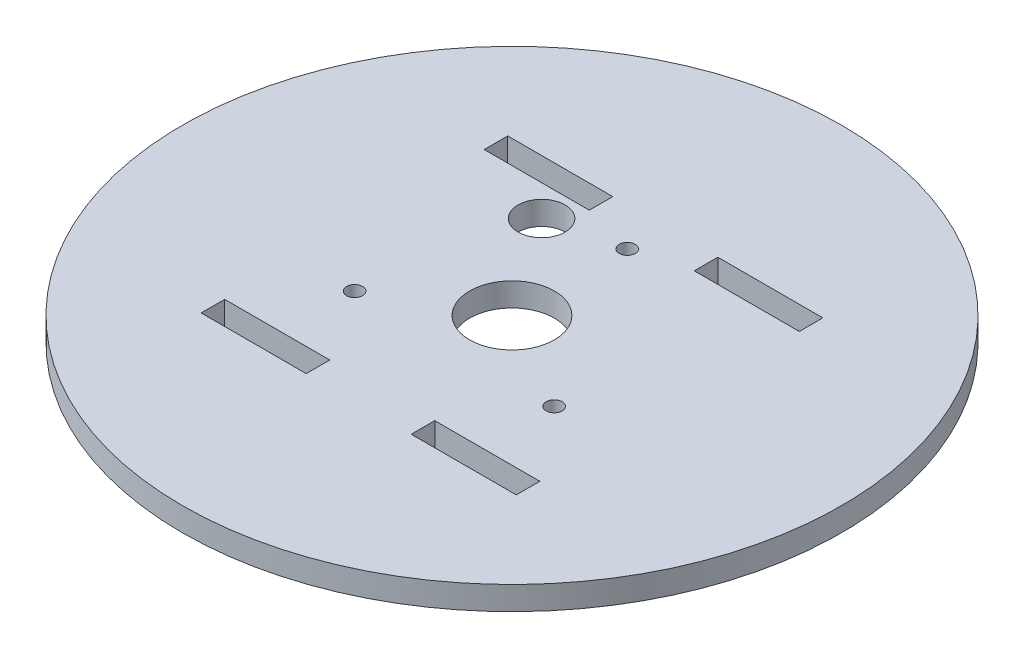
ISO-10303-21;
HEADER;
FILE_DESCRIPTION(('STEP AP214'),'2;1');
FILE_NAME('part.step','',(''),(''),'','','');
FILE_SCHEMA(('AUTOMOTIVE_DESIGN { 1 0 10303 214 1 1 1 1 }'));
ENDSEC;
DATA;
#1=APPLICATION_CONTEXT('core data for automotive mechanical design processes');
#2=APPLICATION_PROTOCOL_DEFINITION('international standard','automotive_design',2000,#1);
#3=PRODUCT_CONTEXT('',#1,'mechanical');
#4=PRODUCT('Part','Part','',(#3));
#5=PRODUCT_RELATED_PRODUCT_CATEGORY('part','',(#4));
#6=PRODUCT_DEFINITION_FORMATION('','',#4);
#7=PRODUCT_DEFINITION_CONTEXT('part definition',#1,'design');
#8=PRODUCT_DEFINITION('design','',#6,#7);
#9=PRODUCT_DEFINITION_SHAPE('','',#8);
#10=(LENGTH_UNIT() NAMED_UNIT(*) SI_UNIT(.MILLI.,.METRE.));
#11=(NAMED_UNIT(*) PLANE_ANGLE_UNIT() SI_UNIT($,.RADIAN.));
#12=(NAMED_UNIT(*) SI_UNIT($,.STERADIAN.) SOLID_ANGLE_UNIT());
#13=UNCERTAINTY_MEASURE_WITH_UNIT(LENGTH_MEASURE(1.E-05),#10,'distance_accuracy_value','');
#14=(GEOMETRIC_REPRESENTATION_CONTEXT(3) GLOBAL_UNCERTAINTY_ASSIGNED_CONTEXT((#13)) GLOBAL_UNIT_ASSIGNED_CONTEXT((#10,
#11,#12)) REPRESENTATION_CONTEXT('',''));
#15=CARTESIAN_POINT('',(0.,0.,0.));
#16=DIRECTION('',(0.,0.,1.));
#17=DIRECTION('',(1.,0.,0.));
#18=AXIS2_PLACEMENT_3D('',#15,#16,#17);
#19=CARTESIAN_POINT('',(0.,6.35,0.));
#20=DIRECTION('',(0.,1.,0.));
#21=DIRECTION('',(0.,0.,1.));
#22=AXIS2_PLACEMENT_3D('',#19,#20,#21);
#23=PLANE('',#22);
#24=DIRECTION('',(0.,0.,-1.));
#25=VECTOR('',#24,1.);
#26=CARTESIAN_POINT('',(-14.1666666666667,6.35,41.35));
#27=LINE('',#26,#25);
#28=CARTESIAN_POINT('',(-14.1666666666667,6.35,41.35));
#29=VERTEX_POINT('',#28);
#30=CARTESIAN_POINT('',(-14.1666666666667,6.35,35.));
#31=VERTEX_POINT('',#30);
#32=EDGE_CURVE('E46',#29,#31,#27,.T.);
#33=ORIENTED_EDGE('',*,*,#32,.F.);
#34=DIRECTION('',(1.,0.,0.));
#35=VECTOR('',#34,1.);
#36=CARTESIAN_POINT('',(-42.5,6.35,41.35));
#37=LINE('',#36,#35);
#38=CARTESIAN_POINT('',(-42.5,6.35,41.35));
#39=VERTEX_POINT('',#38);
#40=EDGE_CURVE('E152',#39,#29,#37,.T.);
#41=ORIENTED_EDGE('',*,*,#40,.F.);
#42=DIRECTION('',(0.,0.,1.));
#43=VECTOR('',#42,1.);
#44=CARTESIAN_POINT('',(-42.5,6.35,35.));
#45=LINE('',#44,#43);
#46=CARTESIAN_POINT('',(-42.5,6.35,35.));
#47=VERTEX_POINT('',#46);
#48=EDGE_CURVE('E172',#47,#39,#45,.T.);
#49=ORIENTED_EDGE('',*,*,#48,.F.);
#50=DIRECTION('',(-1.,0.,0.));
#51=VECTOR('',#50,1.);
#52=CARTESIAN_POINT('',(-14.1666666666667,6.35,35.));
#53=LINE('',#52,#51);
#54=EDGE_CURVE('E166',#31,#47,#53,.T.);
#55=ORIENTED_EDGE('',*,*,#54,.F.);
#56=EDGE_LOOP('',(#33,#41,#49,#55));
#57=FACE_BOUND('',#56,.T.);
#58=DIRECTION('',(0.,0.,-1.));
#59=VECTOR('',#58,1.);
#60=CARTESIAN_POINT('',(42.5,6.35,41.35));
#61=LINE('',#60,#59);
#62=CARTESIAN_POINT('',(42.5,6.35,41.35));
#63=VERTEX_POINT('',#62);
#64=CARTESIAN_POINT('',(42.5,6.35,35.));
#65=VERTEX_POINT('',#64);
#66=EDGE_CURVE('E188',#63,#65,#61,.T.);
#67=ORIENTED_EDGE('',*,*,#66,.F.);
#68=DIRECTION('',(1.,0.,0.));
#69=VECTOR('',#68,1.);
#70=CARTESIAN_POINT('',(14.1666666666667,6.35,41.35));
#71=LINE('',#70,#69);
#72=CARTESIAN_POINT('',(14.1666666666667,6.35,41.35));
#73=VERTEX_POINT('',#72);
#74=EDGE_CURVE('E196',#73,#63,#71,.T.);
#75=ORIENTED_EDGE('',*,*,#74,.F.);
#76=DIRECTION('',(0.,0.,1.));
#77=VECTOR('',#76,1.);
#78=CARTESIAN_POINT('',(14.1666666666667,6.35,35.));
#79=LINE('',#78,#77);
#80=CARTESIAN_POINT('',(14.1666666666667,6.35,35.));
#81=VERTEX_POINT('',#80);
#82=EDGE_CURVE('E193',#81,#73,#79,.T.);
#83=ORIENTED_EDGE('',*,*,#82,.F.);
#84=DIRECTION('',(-1.,0.,0.));
#85=VECTOR('',#84,1.);
#86=CARTESIAN_POINT('',(42.5,6.35,35.));
#87=LINE('',#86,#85);
#88=EDGE_CURVE('E190',#65,#81,#87,.T.);
#89=ORIENTED_EDGE('',*,*,#88,.F.);
#90=EDGE_LOOP('',(#67,#75,#83,#89));
#91=FACE_BOUND('',#90,.T.);
#92=DIRECTION('',(1.,0.,0.));
#93=VECTOR('',#92,1.);
#94=CARTESIAN_POINT('',(42.5,6.35,-35.));
#95=LINE('',#94,#93);
#96=CARTESIAN_POINT('',(14.1666666666667,6.35,-35.));
#97=VERTEX_POINT('',#96);
#98=CARTESIAN_POINT('',(42.5,6.35,-35.));
#99=VERTEX_POINT('',#98);
#100=EDGE_CURVE('E219',#97,#99,#95,.T.);
#101=ORIENTED_EDGE('',*,*,#100,.F.);
#102=DIRECTION('',(0.,0.,1.));
#103=VECTOR('',#102,1.);
#104=CARTESIAN_POINT('',(14.1666666666667,6.35,-35.));
#105=LINE('',#104,#103);
#106=CARTESIAN_POINT('',(14.1666666666667,6.35,-41.35));
#107=VERTEX_POINT('',#106);
#108=EDGE_CURVE('E227',#107,#97,#105,.T.);
#109=ORIENTED_EDGE('',*,*,#108,.F.);
#110=DIRECTION('',(-1.,0.,0.));
#111=VECTOR('',#110,1.);
#112=CARTESIAN_POINT('',(14.1666666666667,6.35,-41.35));
#113=LINE('',#112,#111);
#114=CARTESIAN_POINT('',(42.5,6.35,-41.35));
#115=VERTEX_POINT('',#114);
#116=EDGE_CURVE('E224',#115,#107,#113,.T.);
#117=ORIENTED_EDGE('',*,*,#116,.F.);
#118=DIRECTION('',(0.,0.,-1.));
#119=VECTOR('',#118,1.);
#120=CARTESIAN_POINT('',(42.5,6.35,-41.35));
#121=LINE('',#120,#119);
#122=EDGE_CURVE('E221',#99,#115,#121,.T.);
#123=ORIENTED_EDGE('',*,*,#122,.F.);
#124=EDGE_LOOP('',(#101,#109,#117,#123));
#125=FACE_BOUND('',#124,.T.);
#126=DIRECTION('',(1.,0.,0.));
#127=VECTOR('',#126,1.);
#128=CARTESIAN_POINT('',(-14.1666666666667,6.35,-35.));
#129=LINE('',#128,#127);
#130=CARTESIAN_POINT('',(-42.5,6.35,-35.));
#131=VERTEX_POINT('',#130);
#132=CARTESIAN_POINT('',(-14.1666666666667,6.35,-35.));
#133=VERTEX_POINT('',#132);
#134=EDGE_CURVE('E250',#131,#133,#129,.T.);
#135=ORIENTED_EDGE('',*,*,#134,.F.);
#136=DIRECTION('',(0.,0.,1.));
#137=VECTOR('',#136,1.);
#138=CARTESIAN_POINT('',(-42.5,6.35,-35.));
#139=LINE('',#138,#137);
#140=CARTESIAN_POINT('',(-42.5,6.35,-41.35));
#141=VERTEX_POINT('',#140);
#142=EDGE_CURVE('E258',#141,#131,#139,.T.);
#143=ORIENTED_EDGE('',*,*,#142,.F.);
#144=DIRECTION('',(-1.,0.,0.));
#145=VECTOR('',#144,1.);
#146=CARTESIAN_POINT('',(-42.5,6.35,-41.35));
#147=LINE('',#146,#145);
#148=CARTESIAN_POINT('',(-14.1666666666667,6.35,-41.35));
#149=VERTEX_POINT('',#148);
#150=EDGE_CURVE('E255',#149,#141,#147,.T.);
#151=ORIENTED_EDGE('',*,*,#150,.F.);
#152=DIRECTION('',(0.,0.,-1.));
#153=VECTOR('',#152,1.);
#154=CARTESIAN_POINT('',(-14.1666666666667,6.35,-41.35));
#155=LINE('',#154,#153);
#156=EDGE_CURVE('E252',#133,#149,#155,.T.);
#157=ORIENTED_EDGE('',*,*,#156,.F.);
#158=EDGE_LOOP('',(#135,#143,#151,#157));
#159=FACE_BOUND('',#158,.T.);
#160=CARTESIAN_POINT('',(26.9238637782543,6.35,15.5444999999999));
#161=DIRECTION('',(0.,1.,0.));
#162=DIRECTION('',(0.,0.,1.));
#163=AXIS2_PLACEMENT_3D('',#160,#161,#162);
#164=CIRCLE('',#163,2.159);
#165=CARTESIAN_POINT('',(26.9238637782543,6.35,17.7034999999999));
#166=VERTEX_POINT('',#165);
#167=EDGE_CURVE('E280',#166,#166,#164,.T.);
#168=ORIENTED_EDGE('',*,*,#167,.F.);
#169=EDGE_LOOP('',(#168));
#170=FACE_BOUND('',#169,.T.);
#171=CARTESIAN_POINT('',(0.,6.35,-31.089));
#172=DIRECTION('',(0.,1.,0.));
#173=DIRECTION('',(0.,0.,1.));
#174=AXIS2_PLACEMENT_3D('',#171,#172,#173);
#175=CIRCLE('',#174,2.159);
#176=CARTESIAN_POINT('',(0.,6.35,-28.93));
#177=VERTEX_POINT('',#176);
#178=EDGE_CURVE('E292',#177,#177,#175,.T.);
#179=ORIENTED_EDGE('',*,*,#178,.F.);
#180=EDGE_LOOP('',(#179));
#181=FACE_BOUND('',#180,.T.);
#182=CARTESIAN_POINT('',(0.,6.35,0.));
#183=DIRECTION('',(0.,1.,0.));
#184=DIRECTION('',(0.,0.,1.));
#185=AXIS2_PLACEMENT_3D('',#182,#183,#184);
#186=CIRCLE('',#185,88.9);
#187=CARTESIAN_POINT('',(0.,6.35,88.9));
#188=VERTEX_POINT('',#187);
#189=EDGE_CURVE('E11',#188,#188,#186,.T.);
#190=ORIENTED_EDGE('',*,*,#189,.T.);
#191=EDGE_LOOP('',(#190));
#192=FACE_BOUND('',#191,.T.);
#193=CARTESIAN_POINT('',(0.,6.35,0.));
#194=DIRECTION('',(0.,1.,0.));
#195=DIRECTION('',(0.,0.,1.));
#196=AXIS2_PLACEMENT_3D('',#193,#194,#195);
#197=CIRCLE('',#196,11.43);
#198=CARTESIAN_POINT('',(0.,6.35,11.43));
#199=VERTEX_POINT('',#198);
#200=EDGE_CURVE('E298',#199,#199,#197,.T.);
#201=ORIENTED_EDGE('',*,*,#200,.F.);
#202=EDGE_LOOP('',(#201));
#203=FACE_BOUND('',#202,.T.);
#204=CARTESIAN_POINT('',(-18.6481170986451,6.35,-26.6322712639238));
#205=DIRECTION('',(0.,1.,0.));
#206=DIRECTION('',(0.,0.,1.));
#207=AXIS2_PLACEMENT_3D('',#204,#205,#206);
#208=CIRCLE('',#207,6.35);
#209=CARTESIAN_POINT('',(-18.6481170986451,6.35,-20.2822712639238));
#210=VERTEX_POINT('',#209);
#211=EDGE_CURVE('E286',#210,#210,#208,.T.);
#212=ORIENTED_EDGE('',*,*,#211,.F.);
#213=EDGE_LOOP('',(#212));
#214=FACE_BOUND('',#213,.T.);
#215=CARTESIAN_POINT('',(-26.9238637782543,6.35,15.5444999999999));
#216=DIRECTION('',(0.,1.,0.));
#217=DIRECTION('',(0.,0.,1.));
#218=AXIS2_PLACEMENT_3D('',#215,#216,#217);
#219=CIRCLE('',#218,2.159);
#220=CARTESIAN_POINT('',(-26.9238637782543,6.35,17.7034999999999));
#221=VERTEX_POINT('',#220);
#222=EDGE_CURVE('E274',#221,#221,#219,.T.);
#223=ORIENTED_EDGE('',*,*,#222,.F.);
#224=EDGE_LOOP('',(#223));
#225=FACE_BOUND('',#224,.T.);
#226=ADVANCED_FACE('F31',(#57,#91,#125,#159,#170,#181,#192,#203,#214,#225),#23,.T.);
#227=CARTESIAN_POINT('',(0.,0.,0.));
#228=DIRECTION('',(0.,1.,0.));
#229=DIRECTION('',(0.,0.,1.));
#230=AXIS2_PLACEMENT_3D('',#227,#228,#229);
#231=PLANE('',#230);
#232=DIRECTION('',(-1.,0.,0.));
#233=VECTOR('',#232,1.);
#234=CARTESIAN_POINT('',(-42.5,0.,41.35));
#235=LINE('',#234,#233);
#236=CARTESIAN_POINT('',(-14.1666666666667,0.,41.35));
#237=VERTEX_POINT('',#236);
#238=CARTESIAN_POINT('',(-42.5,0.,41.35));
#239=VERTEX_POINT('',#238);
#240=EDGE_CURVE('E164',#237,#239,#235,.T.);
#241=ORIENTED_EDGE('',*,*,#240,.F.);
#242=DIRECTION('',(0.,0.,1.));
#243=VECTOR('',#242,1.);
#244=CARTESIAN_POINT('',(-14.1666666666667,0.,41.35));
#245=LINE('',#244,#243);
#246=CARTESIAN_POINT('',(-14.1666666666667,0.,35.));
#247=VERTEX_POINT('',#246);
#248=EDGE_CURVE('E146',#247,#237,#245,.T.);
#249=ORIENTED_EDGE('',*,*,#248,.F.);
#250=DIRECTION('',(1.,0.,0.));
#251=VECTOR('',#250,1.);
#252=CARTESIAN_POINT('',(-14.1666666666667,0.,35.));
#253=LINE('',#252,#251);
#254=CARTESIAN_POINT('',(-42.5,0.,35.));
#255=VERTEX_POINT('',#254);
#256=EDGE_CURVE('E155',#255,#247,#253,.T.);
#257=ORIENTED_EDGE('',*,*,#256,.F.);
#258=DIRECTION('',(0.,0.,-1.));
#259=VECTOR('',#258,1.);
#260=CARTESIAN_POINT('',(-42.5,0.,35.));
#261=LINE('',#260,#259);
#262=EDGE_CURVE('E54',#239,#255,#261,.T.);
#263=ORIENTED_EDGE('',*,*,#262,.F.);
#264=EDGE_LOOP('',(#241,#249,#257,#263));
#265=FACE_BOUND('',#264,.T.);
#266=DIRECTION('',(-1.,0.,0.));
#267=VECTOR('',#266,1.);
#268=CARTESIAN_POINT('',(14.1666666666667,0.,41.35));
#269=LINE('',#268,#267);
#270=CARTESIAN_POINT('',(42.5,0.,41.35));
#271=VERTEX_POINT('',#270);
#272=CARTESIAN_POINT('',(14.1666666666667,0.,41.35));
#273=VERTEX_POINT('',#272);
#274=EDGE_CURVE('E182',#271,#273,#269,.T.);
#275=ORIENTED_EDGE('',*,*,#274,.F.);
#276=DIRECTION('',(0.,0.,1.));
#277=VECTOR('',#276,1.);
#278=CARTESIAN_POINT('',(42.5,0.,41.35));
#279=LINE('',#278,#277);
#280=CARTESIAN_POINT('',(42.5,0.,35.));
#281=VERTEX_POINT('',#280);
#282=EDGE_CURVE('E185',#281,#271,#279,.T.);
#283=ORIENTED_EDGE('',*,*,#282,.F.);
#284=DIRECTION('',(1.,0.,0.));
#285=VECTOR('',#284,1.);
#286=CARTESIAN_POINT('',(42.5,0.,35.));
#287=LINE('',#286,#285);
#288=CARTESIAN_POINT('',(14.1666666666667,0.,35.));
#289=VERTEX_POINT('',#288);
#290=EDGE_CURVE('E202',#289,#281,#287,.T.);
#291=ORIENTED_EDGE('',*,*,#290,.F.);
#292=DIRECTION('',(0.,0.,-1.));
#293=VECTOR('',#292,1.);
#294=CARTESIAN_POINT('',(14.1666666666667,0.,35.));
#295=LINE('',#294,#293);
#296=EDGE_CURVE('E158',#273,#289,#295,.T.);
#297=ORIENTED_EDGE('',*,*,#296,.F.);
#298=EDGE_LOOP('',(#275,#283,#291,#297));
#299=FACE_BOUND('',#298,.T.);
#300=DIRECTION('',(0.,0.,-1.));
#301=VECTOR('',#300,1.);
#302=CARTESIAN_POINT('',(14.1666666666667,0.,-35.));
#303=LINE('',#302,#301);
#304=CARTESIAN_POINT('',(14.1666666666667,0.,-35.));
#305=VERTEX_POINT('',#304);
#306=CARTESIAN_POINT('',(14.1666666666667,0.,-41.35));
#307=VERTEX_POINT('',#306);
#308=EDGE_CURVE('E213',#305,#307,#303,.T.);
#309=ORIENTED_EDGE('',*,*,#308,.F.);
#310=DIRECTION('',(-1.,0.,0.));
#311=VECTOR('',#310,1.);
#312=CARTESIAN_POINT('',(42.5,0.,-35.));
#313=LINE('',#312,#311);
#314=CARTESIAN_POINT('',(42.5,0.,-35.));
#315=VERTEX_POINT('',#314);
#316=EDGE_CURVE('E216',#315,#305,#313,.T.);
#317=ORIENTED_EDGE('',*,*,#316,.F.);
#318=DIRECTION('',(0.,0.,1.));
#319=VECTOR('',#318,1.);
#320=CARTESIAN_POINT('',(42.5,0.,-41.35));
#321=LINE('',#320,#319);
#322=CARTESIAN_POINT('',(42.5,0.,-41.35));
#323=VERTEX_POINT('',#322);
#324=EDGE_CURVE('E233',#323,#315,#321,.T.);
#325=ORIENTED_EDGE('',*,*,#324,.F.);
#326=DIRECTION('',(1.,0.,0.));
#327=VECTOR('',#326,1.);
#328=CARTESIAN_POINT('',(14.1666666666667,0.,-41.35));
#329=LINE('',#328,#327);
#330=EDGE_CURVE('E211',#307,#323,#329,.T.);
#331=ORIENTED_EDGE('',*,*,#330,.F.);
#332=EDGE_LOOP('',(#309,#317,#325,#331));
#333=FACE_BOUND('',#332,.T.);
#334=DIRECTION('',(0.,0.,-1.));
#335=VECTOR('',#334,1.);
#336=CARTESIAN_POINT('',(-42.5,0.,-35.));
#337=LINE('',#336,#335);
#338=CARTESIAN_POINT('',(-42.5,0.,-35.));
#339=VERTEX_POINT('',#338);
#340=CARTESIAN_POINT('',(-42.5,0.,-41.35));
#341=VERTEX_POINT('',#340);
#342=EDGE_CURVE('E244',#339,#341,#337,.T.);
#343=ORIENTED_EDGE('',*,*,#342,.F.);
#344=DIRECTION('',(-1.,0.,0.));
#345=VECTOR('',#344,1.);
#346=CARTESIAN_POINT('',(-14.1666666666667,0.,-35.));
#347=LINE('',#346,#345);
#348=CARTESIAN_POINT('',(-14.1666666666667,0.,-35.));
#349=VERTEX_POINT('',#348);
#350=EDGE_CURVE('E247',#349,#339,#347,.T.);
#351=ORIENTED_EDGE('',*,*,#350,.F.);
#352=DIRECTION('',(0.,0.,1.));
#353=VECTOR('',#352,1.);
#354=CARTESIAN_POINT('',(-14.1666666666667,0.,-41.35));
#355=LINE('',#354,#353);
#356=CARTESIAN_POINT('',(-14.1666666666667,0.,-41.35));
#357=VERTEX_POINT('',#356);
#358=EDGE_CURVE('E264',#357,#349,#355,.T.);
#359=ORIENTED_EDGE('',*,*,#358,.F.);
#360=DIRECTION('',(1.,0.,0.));
#361=VECTOR('',#360,1.);
#362=CARTESIAN_POINT('',(-42.5,0.,-41.35));
#363=LINE('',#362,#361);
#364=EDGE_CURVE('E242',#341,#357,#363,.T.);
#365=ORIENTED_EDGE('',*,*,#364,.F.);
#366=EDGE_LOOP('',(#343,#351,#359,#365));
#367=FACE_BOUND('',#366,.T.);
#368=CARTESIAN_POINT('',(26.9238637782543,0.,15.5444999999999));
#369=DIRECTION('',(0.,1.,0.));
#370=DIRECTION('',(0.,0.,1.));
#371=AXIS2_PLACEMENT_3D('',#368,#369,#370);
#372=CIRCLE('',#371,2.159);
#373=CARTESIAN_POINT('',(26.9238637782543,0.,17.7034999999999));
#374=VERTEX_POINT('',#373);
#375=EDGE_CURVE('E277',#374,#374,#372,.T.);
#376=ORIENTED_EDGE('',*,*,#375,.T.);
#377=EDGE_LOOP('',(#376));
#378=FACE_BOUND('',#377,.T.);
#379=CARTESIAN_POINT('',(0.,0.,-31.089));
#380=DIRECTION('',(0.,1.,0.));
#381=DIRECTION('',(0.,0.,1.));
#382=AXIS2_PLACEMENT_3D('',#379,#380,#381);
#383=CIRCLE('',#382,2.159);
#384=CARTESIAN_POINT('',(0.,0.,-28.93));
#385=VERTEX_POINT('',#384);
#386=EDGE_CURVE('E289',#385,#385,#383,.T.);
#387=ORIENTED_EDGE('',*,*,#386,.T.);
#388=EDGE_LOOP('',(#387));
#389=FACE_BOUND('',#388,.T.);
#390=CARTESIAN_POINT('',(0.,0.,0.));
#391=DIRECTION('',(0.,1.,0.));
#392=DIRECTION('',(0.,0.,1.));
#393=AXIS2_PLACEMENT_3D('',#390,#391,#392);
#394=CIRCLE('',#393,88.9);
#395=CARTESIAN_POINT('',(0.,0.,88.9));
#396=VERTEX_POINT('',#395);
#397=EDGE_CURVE('E35',#396,#396,#394,.T.);
#398=ORIENTED_EDGE('',*,*,#397,.F.);
#399=EDGE_LOOP('',(#398));
#400=FACE_BOUND('',#399,.T.);
#401=CARTESIAN_POINT('',(0.,0.,0.));
#402=DIRECTION('',(0.,1.,0.));
#403=DIRECTION('',(0.,0.,1.));
#404=AXIS2_PLACEMENT_3D('',#401,#402,#403);
#405=CIRCLE('',#404,11.43);
#406=CARTESIAN_POINT('',(0.,0.,11.43));
#407=VERTEX_POINT('',#406);
#408=EDGE_CURVE('E295',#407,#407,#405,.T.);
#409=ORIENTED_EDGE('',*,*,#408,.T.);
#410=EDGE_LOOP('',(#409));
#411=FACE_BOUND('',#410,.T.);
#412=CARTESIAN_POINT('',(-18.6481170986451,0.,-26.6322712639238));
#413=DIRECTION('',(0.,1.,0.));
#414=DIRECTION('',(0.,0.,1.));
#415=AXIS2_PLACEMENT_3D('',#412,#413,#414);
#416=CIRCLE('',#415,6.35);
#417=CARTESIAN_POINT('',(-18.6481170986451,0.,-20.2822712639238));
#418=VERTEX_POINT('',#417);
#419=EDGE_CURVE('E283',#418,#418,#416,.T.);
#420=ORIENTED_EDGE('',*,*,#419,.T.);
#421=EDGE_LOOP('',(#420));
#422=FACE_BOUND('',#421,.T.);
#423=CARTESIAN_POINT('',(-26.9238637782543,0.,15.5444999999999));
#424=DIRECTION('',(0.,1.,0.));
#425=DIRECTION('',(0.,0.,1.));
#426=AXIS2_PLACEMENT_3D('',#423,#424,#425);
#427=CIRCLE('',#426,2.159);
#428=CARTESIAN_POINT('',(-26.9238637782543,0.,17.7034999999999));
#429=VERTEX_POINT('',#428);
#430=EDGE_CURVE('E273',#429,#429,#427,.T.);
#431=ORIENTED_EDGE('',*,*,#430,.T.);
#432=EDGE_LOOP('',(#431));
#433=FACE_BOUND('',#432,.T.);
#434=ADVANCED_FACE('F161',(#265,#299,#333,#367,#378,#389,#400,#411,#422,#433),#231,.F.);
#435=CARTESIAN_POINT('',(0.,6.35,0.));
#436=DIRECTION('',(0.,-1.,0.));
#437=DIRECTION('',(0.,0.,-1.));
#438=AXIS2_PLACEMENT_3D('',#435,#436,#437);
#439=CYLINDRICAL_SURFACE('',#438,88.9);
#440=ORIENTED_EDGE('',*,*,#189,.F.);
#441=EDGE_LOOP('',(#440));
#442=FACE_BOUND('',#441,.T.);
#443=ORIENTED_EDGE('',*,*,#397,.T.);
#444=EDGE_LOOP('',(#443));
#445=FACE_BOUND('',#444,.T.);
#446=ADVANCED_FACE('F33',(#442,#445),#439,.T.);
#447=CARTESIAN_POINT('',(0.,6.35,0.));
#448=DIRECTION('',(0.,-1.,0.));
#449=DIRECTION('',(0.,0.,-1.));
#450=AXIS2_PLACEMENT_3D('',#447,#448,#449);
#451=CYLINDRICAL_SURFACE('',#450,11.43);
#452=ORIENTED_EDGE('',*,*,#200,.T.);
#453=EDGE_LOOP('',(#452));
#454=FACE_BOUND('',#453,.T.);
#455=ORIENTED_EDGE('',*,*,#408,.F.);
#456=EDGE_LOOP('',(#455));
#457=FACE_BOUND('',#456,.T.);
#458=ADVANCED_FACE('F306',(#454,#457),#451,.F.);
#459=CARTESIAN_POINT('',(0.,6.35,-31.089));
#460=DIRECTION('',(0.,-1.,0.));
#461=DIRECTION('',(0.,0.,-1.));
#462=AXIS2_PLACEMENT_3D('',#459,#460,#461);
#463=CYLINDRICAL_SURFACE('',#462,2.159);
#464=ORIENTED_EDGE('',*,*,#178,.T.);
#465=EDGE_LOOP('',(#464));
#466=FACE_BOUND('',#465,.T.);
#467=ORIENTED_EDGE('',*,*,#386,.F.);
#468=EDGE_LOOP('',(#467));
#469=FACE_BOUND('',#468,.T.);
#470=ADVANCED_FACE('F308',(#466,#469),#463,.F.);
#471=CARTESIAN_POINT('',(-18.6481170986451,6.35,-26.6322712639238));
#472=DIRECTION('',(0.,-1.,0.));
#473=DIRECTION('',(0.,0.,-1.));
#474=AXIS2_PLACEMENT_3D('',#471,#472,#473);
#475=CYLINDRICAL_SURFACE('',#474,6.35);
#476=ORIENTED_EDGE('',*,*,#211,.T.);
#477=EDGE_LOOP('',(#476));
#478=FACE_BOUND('',#477,.T.);
#479=ORIENTED_EDGE('',*,*,#419,.F.);
#480=EDGE_LOOP('',(#479));
#481=FACE_BOUND('',#480,.T.);
#482=ADVANCED_FACE('F315',(#478,#481),#475,.F.);
#483=CARTESIAN_POINT('',(26.9238637782543,6.35,15.5444999999999));
#484=DIRECTION('',(0.,-1.,0.));
#485=DIRECTION('',(0.,0.,-1.));
#486=AXIS2_PLACEMENT_3D('',#483,#484,#485);
#487=CYLINDRICAL_SURFACE('',#486,2.159);
#488=ORIENTED_EDGE('',*,*,#167,.T.);
#489=EDGE_LOOP('',(#488));
#490=FACE_BOUND('',#489,.T.);
#491=ORIENTED_EDGE('',*,*,#375,.F.);
#492=EDGE_LOOP('',(#491));
#493=FACE_BOUND('',#492,.T.);
#494=ADVANCED_FACE('F355',(#490,#493),#487,.F.);
#495=CARTESIAN_POINT('',(-26.9238637782543,6.35,15.5444999999999));
#496=DIRECTION('',(0.,-1.,0.));
#497=DIRECTION('',(0.,0.,-1.));
#498=AXIS2_PLACEMENT_3D('',#495,#496,#497);
#499=CYLINDRICAL_SURFACE('',#498,2.159);
#500=ORIENTED_EDGE('',*,*,#222,.T.);
#501=EDGE_LOOP('',(#500));
#502=FACE_BOUND('',#501,.T.);
#503=ORIENTED_EDGE('',*,*,#430,.F.);
#504=EDGE_LOOP('',(#503));
#505=FACE_BOUND('',#504,.T.);
#506=ADVANCED_FACE('F351',(#502,#505),#499,.F.);
#507=CARTESIAN_POINT('',(-14.1666666666667,-0.00100000000000013,-35.));
#508=DIRECTION('',(0.,0.,1.));
#509=DIRECTION('',(1.,0.,0.));
#510=AXIS2_PLACEMENT_3D('',#507,#508,#509);
#511=PLANE('',#510);
#512=ORIENTED_EDGE('',*,*,#350,.T.);
#513=DIRECTION('',(0.,1.,0.));
#514=VECTOR('',#513,1.);
#515=CARTESIAN_POINT('',(-42.5,-0.00100000000000013,-35.));
#516=LINE('',#515,#514);
#517=EDGE_CURVE('E262',#339,#131,#516,.T.);
#518=ORIENTED_EDGE('',*,*,#517,.T.);
#519=ORIENTED_EDGE('',*,*,#134,.T.);
#520=DIRECTION('',(0.,1.,0.));
#521=VECTOR('',#520,1.);
#522=CARTESIAN_POINT('',(-14.1666666666667,-0.00100000000000013,-35.));
#523=LINE('',#522,#521);
#524=EDGE_CURVE('E261',#349,#133,#523,.T.);
#525=ORIENTED_EDGE('',*,*,#524,.F.);
#526=EDGE_LOOP('',(#512,#518,#519,#525));
#527=FACE_BOUND('',#526,.T.);
#528=ADVANCED_FACE('F354',(#527),#511,.F.);
#529=CARTESIAN_POINT('',(-42.5,-0.00100000000000013,-35.));
#530=DIRECTION('',(-1.,0.,0.));
#531=DIRECTION('',(0.,0.,1.));
#532=AXIS2_PLACEMENT_3D('',#529,#530,#531);
#533=PLANE('',#532);
#534=ORIENTED_EDGE('',*,*,#342,.T.);
#535=DIRECTION('',(0.,1.,0.));
#536=VECTOR('',#535,1.);
#537=CARTESIAN_POINT('',(-42.5,-0.00100000000000013,-41.35));
#538=LINE('',#537,#536);
#539=EDGE_CURVE('E265',#341,#141,#538,.T.);
#540=ORIENTED_EDGE('',*,*,#539,.T.);
#541=ORIENTED_EDGE('',*,*,#142,.T.);
#542=ORIENTED_EDGE('',*,*,#517,.F.);
#543=EDGE_LOOP('',(#534,#540,#541,#542));
#544=FACE_BOUND('',#543,.T.);
#545=ADVANCED_FACE('F363',(#544),#533,.F.);
#546=CARTESIAN_POINT('',(-42.5,-0.00100000000000013,-41.35));
#547=DIRECTION('',(0.,0.,-1.));
#548=DIRECTION('',(-1.,0.,0.));
#549=AXIS2_PLACEMENT_3D('',#546,#547,#548);
#550=PLANE('',#549);
#551=ORIENTED_EDGE('',*,*,#364,.T.);
#552=DIRECTION('',(0.,1.,0.));
#553=VECTOR('',#552,1.);
#554=CARTESIAN_POINT('',(-14.1666666666667,-0.00100000000000013,-41.35));
#555=LINE('',#554,#553);
#556=EDGE_CURVE('E267',#357,#149,#555,.T.);
#557=ORIENTED_EDGE('',*,*,#556,.T.);
#558=ORIENTED_EDGE('',*,*,#150,.T.);
#559=ORIENTED_EDGE('',*,*,#539,.F.);
#560=EDGE_LOOP('',(#551,#557,#558,#559));
#561=FACE_BOUND('',#560,.T.);
#562=ADVANCED_FACE('F412',(#561),#550,.F.);
#563=CARTESIAN_POINT('',(-14.1666666666667,-0.00100000000000013,-41.35));
#564=DIRECTION('',(1.,0.,0.));
#565=DIRECTION('',(0.,0.,-1.));
#566=AXIS2_PLACEMENT_3D('',#563,#564,#565);
#567=PLANE('',#566);
#568=ORIENTED_EDGE('',*,*,#358,.T.);
#569=ORIENTED_EDGE('',*,*,#524,.T.);
#570=ORIENTED_EDGE('',*,*,#156,.T.);
#571=ORIENTED_EDGE('',*,*,#556,.F.);
#572=EDGE_LOOP('',(#568,#569,#570,#571));
#573=FACE_BOUND('',#572,.T.);
#574=ADVANCED_FACE('F422',(#573),#567,.F.);
#575=CARTESIAN_POINT('',(42.5,-0.00100000000000013,-35.));
#576=DIRECTION('',(0.,0.,1.));
#577=DIRECTION('',(1.,0.,0.));
#578=AXIS2_PLACEMENT_3D('',#575,#576,#577);
#579=PLANE('',#578);
#580=ORIENTED_EDGE('',*,*,#316,.T.);
#581=DIRECTION('',(0.,1.,0.));
#582=VECTOR('',#581,1.);
#583=CARTESIAN_POINT('',(14.1666666666667,-0.00100000000000013,-35.));
#584=LINE('',#583,#582);
#585=EDGE_CURVE('E231',#305,#97,#584,.T.);
#586=ORIENTED_EDGE('',*,*,#585,.T.);
#587=ORIENTED_EDGE('',*,*,#100,.T.);
#588=DIRECTION('',(0.,1.,0.));
#589=VECTOR('',#588,1.);
#590=CARTESIAN_POINT('',(42.5,-0.00100000000000013,-35.));
#591=LINE('',#590,#589);
#592=EDGE_CURVE('E230',#315,#99,#591,.T.);
#593=ORIENTED_EDGE('',*,*,#592,.F.);
#594=EDGE_LOOP('',(#580,#586,#587,#593));
#595=FACE_BOUND('',#594,.T.);
#596=ADVANCED_FACE('F432',(#595),#579,.F.);
#597=CARTESIAN_POINT('',(14.1666666666667,-0.00100000000000013,-35.));
#598=DIRECTION('',(-1.,0.,0.));
#599=DIRECTION('',(0.,0.,1.));
#600=AXIS2_PLACEMENT_3D('',#597,#598,#599);
#601=PLANE('',#600);
#602=ORIENTED_EDGE('',*,*,#308,.T.);
#603=DIRECTION('',(0.,1.,0.));
#604=VECTOR('',#603,1.);
#605=CARTESIAN_POINT('',(14.1666666666667,-0.00100000000000013,-41.35));
#606=LINE('',#605,#604);
#607=EDGE_CURVE('E234',#307,#107,#606,.T.);
#608=ORIENTED_EDGE('',*,*,#607,.T.);
#609=ORIENTED_EDGE('',*,*,#108,.T.);
#610=ORIENTED_EDGE('',*,*,#585,.F.);
#611=EDGE_LOOP('',(#602,#608,#609,#610));
#612=FACE_BOUND('',#611,.T.);
#613=ADVANCED_FACE('F441',(#612),#601,.F.);
#614=CARTESIAN_POINT('',(14.1666666666667,-0.00100000000000013,-41.35));
#615=DIRECTION('',(0.,0.,-1.));
#616=DIRECTION('',(-1.,0.,0.));
#617=AXIS2_PLACEMENT_3D('',#614,#615,#616);
#618=PLANE('',#617);
#619=ORIENTED_EDGE('',*,*,#330,.T.);
#620=DIRECTION('',(0.,1.,0.));
#621=VECTOR('',#620,1.);
#622=CARTESIAN_POINT('',(42.5,-0.00100000000000013,-41.35));
#623=LINE('',#622,#621);
#624=EDGE_CURVE('E236',#323,#115,#623,.T.);
#625=ORIENTED_EDGE('',*,*,#624,.T.);
#626=ORIENTED_EDGE('',*,*,#116,.T.);
#627=ORIENTED_EDGE('',*,*,#607,.F.);
#628=EDGE_LOOP('',(#619,#625,#626,#627));
#629=FACE_BOUND('',#628,.T.);
#630=ADVANCED_FACE('F451',(#629),#618,.F.);
#631=CARTESIAN_POINT('',(42.5,-0.00100000000000013,-41.35));
#632=DIRECTION('',(1.,0.,0.));
#633=DIRECTION('',(0.,0.,-1.));
#634=AXIS2_PLACEMENT_3D('',#631,#632,#633);
#635=PLANE('',#634);
#636=ORIENTED_EDGE('',*,*,#324,.T.);
#637=ORIENTED_EDGE('',*,*,#592,.T.);
#638=ORIENTED_EDGE('',*,*,#122,.T.);
#639=ORIENTED_EDGE('',*,*,#624,.F.);
#640=EDGE_LOOP('',(#636,#637,#638,#639));
#641=FACE_BOUND('',#640,.T.);
#642=ADVANCED_FACE('F461',(#641),#635,.F.);
#643=CARTESIAN_POINT('',(42.5,-0.00100000000000013,41.35));
#644=DIRECTION('',(1.,0.,0.));
#645=DIRECTION('',(0.,0.,-1.));
#646=AXIS2_PLACEMENT_3D('',#643,#644,#645);
#647=PLANE('',#646);
#648=ORIENTED_EDGE('',*,*,#282,.T.);
#649=DIRECTION('',(0.,1.,0.));
#650=VECTOR('',#649,1.);
#651=CARTESIAN_POINT('',(42.5,-0.00100000000000013,41.35));
#652=LINE('',#651,#650);
#653=EDGE_CURVE('E200',#271,#63,#652,.T.);
#654=ORIENTED_EDGE('',*,*,#653,.T.);
#655=ORIENTED_EDGE('',*,*,#66,.T.);
#656=DIRECTION('',(0.,1.,0.));
#657=VECTOR('',#656,1.);
#658=CARTESIAN_POINT('',(42.5,-0.00100000000000013,35.));
#659=LINE('',#658,#657);
#660=EDGE_CURVE('E199',#281,#65,#659,.T.);
#661=ORIENTED_EDGE('',*,*,#660,.F.);
#662=EDGE_LOOP('',(#648,#654,#655,#661));
#663=FACE_BOUND('',#662,.T.);
#664=ADVANCED_FACE('F471',(#663),#647,.F.);
#665=CARTESIAN_POINT('',(14.1666666666667,-0.00100000000000013,41.35));
#666=DIRECTION('',(0.,0.,1.));
#667=DIRECTION('',(1.,0.,0.));
#668=AXIS2_PLACEMENT_3D('',#665,#666,#667);
#669=PLANE('',#668);
#670=ORIENTED_EDGE('',*,*,#274,.T.);
#671=DIRECTION('',(0.,1.,0.));
#672=VECTOR('',#671,1.);
#673=CARTESIAN_POINT('',(14.1666666666667,-0.00100000000000013,41.35));
#674=LINE('',#673,#672);
#675=EDGE_CURVE('E203',#273,#73,#674,.T.);
#676=ORIENTED_EDGE('',*,*,#675,.T.);
#677=ORIENTED_EDGE('',*,*,#74,.T.);
#678=ORIENTED_EDGE('',*,*,#653,.F.);
#679=EDGE_LOOP('',(#670,#676,#677,#678));
#680=FACE_BOUND('',#679,.T.);
#681=ADVANCED_FACE('F481',(#680),#669,.F.);
#682=CARTESIAN_POINT('',(14.1666666666667,-0.00100000000000013,35.));
#683=DIRECTION('',(-1.,0.,0.));
#684=DIRECTION('',(0.,0.,1.));
#685=AXIS2_PLACEMENT_3D('',#682,#683,#684);
#686=PLANE('',#685);
#687=ORIENTED_EDGE('',*,*,#296,.T.);
#688=DIRECTION('',(0.,1.,0.));
#689=VECTOR('',#688,1.);
#690=CARTESIAN_POINT('',(14.1666666666667,-0.00100000000000013,35.));
#691=LINE('',#690,#689);
#692=EDGE_CURVE('E205',#289,#81,#691,.T.);
#693=ORIENTED_EDGE('',*,*,#692,.T.);
#694=ORIENTED_EDGE('',*,*,#82,.T.);
#695=ORIENTED_EDGE('',*,*,#675,.F.);
#696=EDGE_LOOP('',(#687,#693,#694,#695));
#697=FACE_BOUND('',#696,.T.);
#698=ADVANCED_FACE('F491',(#697),#686,.F.);
#699=CARTESIAN_POINT('',(42.5,-0.00100000000000013,35.));
#700=DIRECTION('',(0.,0.,-1.));
#701=DIRECTION('',(-1.,0.,0.));
#702=AXIS2_PLACEMENT_3D('',#699,#700,#701);
#703=PLANE('',#702);
#704=ORIENTED_EDGE('',*,*,#290,.T.);
#705=ORIENTED_EDGE('',*,*,#660,.T.);
#706=ORIENTED_EDGE('',*,*,#88,.T.);
#707=ORIENTED_EDGE('',*,*,#692,.F.);
#708=EDGE_LOOP('',(#704,#705,#706,#707));
#709=FACE_BOUND('',#708,.T.);
#710=ADVANCED_FACE('F501',(#709),#703,.F.);
#711=CARTESIAN_POINT('',(-14.1666666666667,-0.00100000000000013,41.35));
#712=DIRECTION('',(1.,0.,0.));
#713=DIRECTION('',(0.,0.,-1.));
#714=AXIS2_PLACEMENT_3D('',#711,#712,#713);
#715=PLANE('',#714);
#716=ORIENTED_EDGE('',*,*,#248,.T.);
#717=DIRECTION('',(0.,1.,0.));
#718=VECTOR('',#717,1.);
#719=CARTESIAN_POINT('',(-14.1666666666667,-0.00100000000000013,41.35));
#720=LINE('',#719,#718);
#721=EDGE_CURVE('E159',#237,#29,#720,.T.);
#722=ORIENTED_EDGE('',*,*,#721,.T.);
#723=ORIENTED_EDGE('',*,*,#32,.T.);
#724=DIRECTION('',(0.,1.,0.));
#725=VECTOR('',#724,1.);
#726=CARTESIAN_POINT('',(-14.1666666666667,-0.00100000000000013,35.));
#727=LINE('',#726,#725);
#728=EDGE_CURVE('E142',#247,#31,#727,.T.);
#729=ORIENTED_EDGE('',*,*,#728,.F.);
#730=EDGE_LOOP('',(#716,#722,#723,#729));
#731=FACE_BOUND('',#730,.T.);
#732=ADVANCED_FACE('F144',(#731),#715,.F.);
#733=CARTESIAN_POINT('',(-42.5,-0.00100000000000013,41.35));
#734=DIRECTION('',(0.,0.,1.));
#735=DIRECTION('',(1.,0.,0.));
#736=AXIS2_PLACEMENT_3D('',#733,#734,#735);
#737=PLANE('',#736);
#738=ORIENTED_EDGE('',*,*,#240,.T.);
#739=DIRECTION('',(0.,1.,0.));
#740=VECTOR('',#739,1.);
#741=CARTESIAN_POINT('',(-42.5,-0.00100000000000013,41.35));
#742=LINE('',#741,#740);
#743=EDGE_CURVE('E178',#239,#39,#742,.T.);
#744=ORIENTED_EDGE('',*,*,#743,.T.);
#745=ORIENTED_EDGE('',*,*,#40,.T.);
#746=ORIENTED_EDGE('',*,*,#721,.F.);
#747=EDGE_LOOP('',(#738,#744,#745,#746));
#748=FACE_BOUND('',#747,.T.);
#749=ADVANCED_FACE('F520',(#748),#737,.F.);
#750=CARTESIAN_POINT('',(-42.5,-0.00100000000000013,35.));
#751=DIRECTION('',(-1.,0.,0.));
#752=DIRECTION('',(0.,0.,1.));
#753=AXIS2_PLACEMENT_3D('',#750,#751,#752);
#754=PLANE('',#753);
#755=ORIENTED_EDGE('',*,*,#262,.T.);
#756=DIRECTION('',(0.,1.,0.));
#757=VECTOR('',#756,1.);
#758=CARTESIAN_POINT('',(-42.5,-0.00100000000000013,35.));
#759=LINE('',#758,#757);
#760=EDGE_CURVE('E151',#255,#47,#759,.T.);
#761=ORIENTED_EDGE('',*,*,#760,.T.);
#762=ORIENTED_EDGE('',*,*,#48,.T.);
#763=ORIENTED_EDGE('',*,*,#743,.F.);
#764=EDGE_LOOP('',(#755,#761,#762,#763));
#765=FACE_BOUND('',#764,.T.);
#766=ADVANCED_FACE('F529',(#765),#754,.F.);
#767=CARTESIAN_POINT('',(-14.1666666666667,-0.00100000000000013,35.));
#768=DIRECTION('',(0.,0.,-1.));
#769=DIRECTION('',(-1.,0.,0.));
#770=AXIS2_PLACEMENT_3D('',#767,#768,#769);
#771=PLANE('',#770);
#772=ORIENTED_EDGE('',*,*,#256,.T.);
#773=ORIENTED_EDGE('',*,*,#728,.T.);
#774=ORIENTED_EDGE('',*,*,#54,.T.);
#775=ORIENTED_EDGE('',*,*,#760,.F.);
#776=EDGE_LOOP('',(#772,#773,#774,#775));
#777=FACE_BOUND('',#776,.T.);
#778=ADVANCED_FACE('F156',(#777),#771,.F.);
#779=CLOSED_SHELL('',(#226,#434,#446,#458,#470,#482,#494,#506,#528,#545,#562,#574,#596,#613,
#630,#642,#664,#681,#698,#710,#732,#749,#766,#778));
#780=MANIFOLD_SOLID_BREP('B2',#779);
#781=ADVANCED_BREP_SHAPE_REPRESENTATION('',(#18,#780),#14);
#782=SHAPE_DEFINITION_REPRESENTATION(#9,#781);
ENDSEC;
END-ISO-10303-21;
